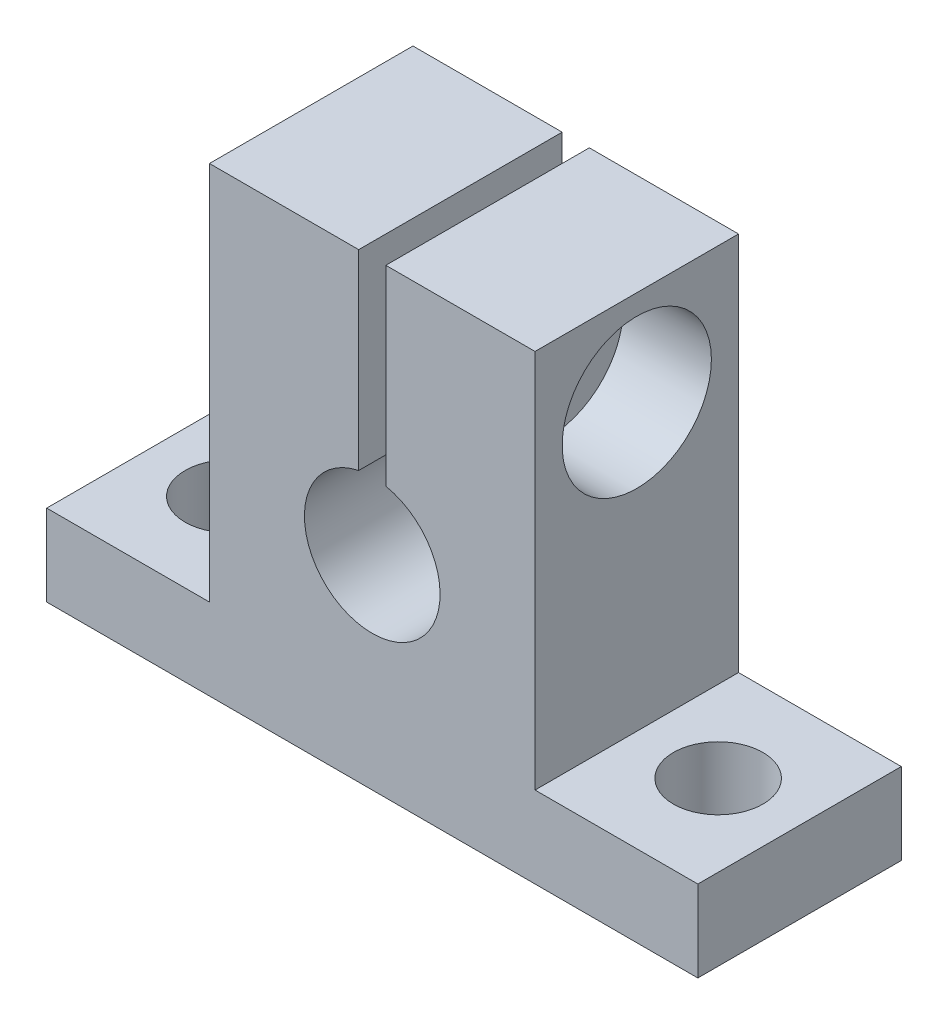
ISO-10303-21;
HEADER;
FILE_DESCRIPTION(('STEP AP214'),'2;1');
FILE_NAME('part.step','',(''),(''),'','','');
FILE_SCHEMA(('AUTOMOTIVE_DESIGN { 1 0 10303 214 1 1 1 1 }'));
ENDSEC;
DATA;
#1=APPLICATION_CONTEXT('core data for automotive mechanical design processes');
#2=APPLICATION_PROTOCOL_DEFINITION('international standard','automotive_design',2000,#1);
#3=PRODUCT_CONTEXT('',#1,'mechanical');
#4=PRODUCT('Part','Part','',(#3));
#5=PRODUCT_RELATED_PRODUCT_CATEGORY('part','',(#4));
#6=PRODUCT_DEFINITION_FORMATION('','',#4);
#7=PRODUCT_DEFINITION_CONTEXT('part definition',#1,'design');
#8=PRODUCT_DEFINITION('design','',#6,#7);
#9=PRODUCT_DEFINITION_SHAPE('','',#8);
#10=(LENGTH_UNIT() NAMED_UNIT(*) SI_UNIT(.MILLI.,.METRE.));
#11=(NAMED_UNIT(*) PLANE_ANGLE_UNIT() SI_UNIT($,.RADIAN.));
#12=(NAMED_UNIT(*) SI_UNIT($,.STERADIAN.) SOLID_ANGLE_UNIT());
#13=UNCERTAINTY_MEASURE_WITH_UNIT(LENGTH_MEASURE(1.E-05),#10,'distance_accuracy_value','');
#14=(GEOMETRIC_REPRESENTATION_CONTEXT(3) GLOBAL_UNCERTAINTY_ASSIGNED_CONTEXT((#13)) GLOBAL_UNIT_ASSIGNED_CONTEXT((#10,
#11,#12)) REPRESENTATION_CONTEXT('',''));
#15=CARTESIAN_POINT('',(0.,0.,0.));
#16=DIRECTION('',(0.,0.,1.));
#17=DIRECTION('',(1.,0.,0.));
#18=AXIS2_PLACEMENT_3D('',#15,#16,#17);
#19=CARTESIAN_POINT('',(12.,6.,7.5));
#20=DIRECTION('',(-1.,0.,0.));
#21=DIRECTION('',(0.,-1.,0.));
#22=AXIS2_PLACEMENT_3D('',#19,#20,#21);
#23=PLANE('',#22);
#24=DIRECTION('',(0.,1.,0.));
#25=VECTOR('',#24,1.);
#26=CARTESIAN_POINT('',(12.,6.,-7.5));
#27=LINE('',#26,#25);
#28=CARTESIAN_POINT('',(12.,6.,-7.5));
#29=VERTEX_POINT('',#28);
#30=CARTESIAN_POINT('',(12.,34.,-7.5));
#31=VERTEX_POINT('',#30);
#32=EDGE_CURVE('E156',#29,#31,#27,.T.);
#33=ORIENTED_EDGE('',*,*,#32,.T.);
#34=DIRECTION('',(0.,0.,-1.));
#35=VECTOR('',#34,1.);
#36=CARTESIAN_POINT('',(12.,34.,7.5));
#37=LINE('',#36,#35);
#38=CARTESIAN_POINT('',(12.,34.,7.5));
#39=VERTEX_POINT('',#38);
#40=EDGE_CURVE('E150',#39,#31,#37,.T.);
#41=ORIENTED_EDGE('',*,*,#40,.F.);
#42=DIRECTION('',(0.,1.,0.));
#43=VECTOR('',#42,1.);
#44=CARTESIAN_POINT('',(12.,6.,7.5));
#45=LINE('',#44,#43);
#46=CARTESIAN_POINT('',(12.,6.,7.5));
#47=VERTEX_POINT('',#46);
#48=EDGE_CURVE('E209',#47,#39,#45,.T.);
#49=ORIENTED_EDGE('',*,*,#48,.F.);
#50=DIRECTION('',(0.,0.,-1.));
#51=VECTOR('',#50,1.);
#52=CARTESIAN_POINT('',(12.,6.,7.5));
#53=LINE('',#52,#51);
#54=EDGE_CURVE('E173',#47,#29,#53,.T.);
#55=ORIENTED_EDGE('',*,*,#54,.T.);
#56=EDGE_LOOP('',(#33,#41,#49,#55));
#57=FACE_BOUND('',#56,.T.);
#58=CARTESIAN_POINT('',(12.,27.,0.));
#59=DIRECTION('',(1.,0.,0.));
#60=DIRECTION('',(0.,0.,-1.));
#61=AXIS2_PLACEMENT_3D('',#58,#59,#60);
#62=CIRCLE('',#61,5.5);
#63=CARTESIAN_POINT('',(12.,27.,-5.5));
#64=VERTEX_POINT('',#63);
#65=EDGE_CURVE('E310',#64,#64,#62,.T.);
#66=ORIENTED_EDGE('',*,*,#65,.F.);
#67=EDGE_LOOP('',(#66));
#68=FACE_BOUND('',#67,.T.);
#69=ADVANCED_FACE('F39',(#57,#68),#23,.F.);
#70=CARTESIAN_POINT('',(12.,34.,7.5));
#71=DIRECTION('',(0.,-1.,0.));
#72=DIRECTION('',(0.,0.,-1.));
#73=AXIS2_PLACEMENT_3D('',#70,#71,#72);
#74=PLANE('',#73);
#75=DIRECTION('',(-1.,0.,0.));
#76=VECTOR('',#75,1.);
#77=CARTESIAN_POINT('',(12.,34.,7.5));
#78=LINE('',#77,#76);
#79=CARTESIAN_POINT('',(-1.,34.,7.5));
#80=VERTEX_POINT('',#79);
#81=CARTESIAN_POINT('',(-12.,34.,7.5));
#82=VERTEX_POINT('',#81);
#83=EDGE_CURVE('E211',#80,#82,#78,.T.);
#84=ORIENTED_EDGE('',*,*,#83,.F.);
#85=DIRECTION('',(0.,0.,1.));
#86=VECTOR('',#85,1.);
#87=CARTESIAN_POINT('',(-1.,34.,-7.5));
#88=LINE('',#87,#86);
#89=CARTESIAN_POINT('',(-1.,34.,-7.5));
#90=VERTEX_POINT('',#89);
#91=EDGE_CURVE('E133',#90,#80,#88,.T.);
#92=ORIENTED_EDGE('',*,*,#91,.F.);
#93=DIRECTION('',(-1.,0.,0.));
#94=VECTOR('',#93,1.);
#95=CARTESIAN_POINT('',(12.,34.,-7.5));
#96=LINE('',#95,#94);
#97=CARTESIAN_POINT('',(-12.,34.,-7.5));
#98=VERTEX_POINT('',#97);
#99=EDGE_CURVE('E152',#90,#98,#96,.T.);
#100=ORIENTED_EDGE('',*,*,#99,.T.);
#101=DIRECTION('',(0.,0.,-1.));
#102=VECTOR('',#101,1.);
#103=CARTESIAN_POINT('',(-12.,34.,7.5));
#104=LINE('',#103,#102);
#105=EDGE_CURVE('E169',#82,#98,#104,.T.);
#106=ORIENTED_EDGE('',*,*,#105,.F.);
#107=EDGE_LOOP('',(#84,#92,#100,#106));
#108=FACE_BOUND('',#107,.T.);
#109=ADVANCED_FACE('F255',(#108),#74,.F.);
#110=CARTESIAN_POINT('',(-24.,6.,7.5));
#111=DIRECTION('',(1.,0.,0.));
#112=DIRECTION('',(0.,0.,-1.));
#113=AXIS2_PLACEMENT_3D('',#110,#111,#112);
#114=PLANE('',#113);
#115=DIRECTION('',(0.,-1.,0.));
#116=VECTOR('',#115,1.);
#117=CARTESIAN_POINT('',(-24.,6.,-7.5));
#118=LINE('',#117,#116);
#119=CARTESIAN_POINT('',(-24.,6.,-7.5));
#120=VERTEX_POINT('',#119);
#121=CARTESIAN_POINT('',(-24.,0.,-7.5));
#122=VERTEX_POINT('',#121);
#123=EDGE_CURVE('E199',#120,#122,#118,.T.);
#124=ORIENTED_EDGE('',*,*,#123,.T.);
#125=DIRECTION('',(0.,0.,-1.));
#126=VECTOR('',#125,1.);
#127=CARTESIAN_POINT('',(-24.,0.,7.5));
#128=LINE('',#127,#126);
#129=CARTESIAN_POINT('',(-24.,0.,7.5));
#130=VERTEX_POINT('',#129);
#131=EDGE_CURVE('E182',#130,#122,#128,.T.);
#132=ORIENTED_EDGE('',*,*,#131,.F.);
#133=DIRECTION('',(0.,-1.,0.));
#134=VECTOR('',#133,1.);
#135=CARTESIAN_POINT('',(-24.,6.,7.5));
#136=LINE('',#135,#134);
#137=CARTESIAN_POINT('',(-24.,6.,7.5));
#138=VERTEX_POINT('',#137);
#139=EDGE_CURVE('E161',#138,#130,#136,.T.);
#140=ORIENTED_EDGE('',*,*,#139,.F.);
#141=DIRECTION('',(0.,0.,-1.));
#142=VECTOR('',#141,1.);
#143=CARTESIAN_POINT('',(-24.,6.,7.5));
#144=LINE('',#143,#142);
#145=EDGE_CURVE('E162',#138,#120,#144,.T.);
#146=ORIENTED_EDGE('',*,*,#145,.T.);
#147=EDGE_LOOP('',(#124,#132,#140,#146));
#148=FACE_BOUND('',#147,.T.);
#149=ADVANCED_FACE('F41',(#148),#114,.F.);
#150=CARTESIAN_POINT('',(-24.,0.,7.5));
#151=DIRECTION('',(0.,1.,0.));
#152=DIRECTION('',(0.,0.,1.));
#153=AXIS2_PLACEMENT_3D('',#150,#151,#152);
#154=PLANE('',#153);
#155=CARTESIAN_POINT('',(18.,0.,0.));
#156=DIRECTION('',(0.,1.,0.));
#157=DIRECTION('',(0.,0.,1.));
#158=AXIS2_PLACEMENT_3D('',#155,#156,#157);
#159=CIRCLE('',#158,3.3);
#160=CARTESIAN_POINT('',(18.,0.,3.29999999999999));
#161=VERTEX_POINT('',#160);
#162=EDGE_CURVE('E293',#161,#161,#159,.T.);
#163=ORIENTED_EDGE('',*,*,#162,.T.);
#164=EDGE_LOOP('',(#163));
#165=FACE_BOUND('',#164,.T.);
#166=CARTESIAN_POINT('',(-18.,0.,0.));
#167=DIRECTION('',(0.,1.,0.));
#168=DIRECTION('',(0.,0.,1.));
#169=AXIS2_PLACEMENT_3D('',#166,#167,#168);
#170=CIRCLE('',#169,3.3);
#171=CARTESIAN_POINT('',(-18.,0.,3.3));
#172=VERTEX_POINT('',#171);
#173=EDGE_CURVE('E296',#172,#172,#170,.T.);
#174=ORIENTED_EDGE('',*,*,#173,.T.);
#175=EDGE_LOOP('',(#174));
#176=FACE_BOUND('',#175,.T.);
#177=DIRECTION('',(1.,0.,0.));
#178=VECTOR('',#177,1.);
#179=CARTESIAN_POINT('',(-24.,0.,-7.5));
#180=LINE('',#179,#178);
#181=CARTESIAN_POINT('',(24.,0.,-7.5));
#182=VERTEX_POINT('',#181);
#183=EDGE_CURVE('E218',#122,#182,#180,.T.);
#184=ORIENTED_EDGE('',*,*,#183,.T.);
#185=DIRECTION('',(0.,0.,-1.));
#186=VECTOR('',#185,1.);
#187=CARTESIAN_POINT('',(24.,0.,7.5));
#188=LINE('',#187,#186);
#189=CARTESIAN_POINT('',(24.,0.,7.5));
#190=VERTEX_POINT('',#189);
#191=EDGE_CURVE('E179',#190,#182,#188,.T.);
#192=ORIENTED_EDGE('',*,*,#191,.F.);
#193=DIRECTION('',(1.,0.,0.));
#194=VECTOR('',#193,1.);
#195=CARTESIAN_POINT('',(-24.,0.,7.5));
#196=LINE('',#195,#194);
#197=EDGE_CURVE('E203',#130,#190,#196,.T.);
#198=ORIENTED_EDGE('',*,*,#197,.F.);
#199=ORIENTED_EDGE('',*,*,#131,.T.);
#200=EDGE_LOOP('',(#184,#192,#198,#199));
#201=FACE_BOUND('',#200,.T.);
#202=ADVANCED_FACE('F240',(#165,#176,#201),#154,.F.);
#203=CARTESIAN_POINT('',(24.,0.,7.5));
#204=DIRECTION('',(-1.,0.,0.));
#205=DIRECTION('',(0.,0.,1.));
#206=AXIS2_PLACEMENT_3D('',#203,#204,#205);
#207=PLANE('',#206);
#208=DIRECTION('',(0.,1.,0.));
#209=VECTOR('',#208,1.);
#210=CARTESIAN_POINT('',(24.,0.,-7.5));
#211=LINE('',#210,#209);
#212=CARTESIAN_POINT('',(24.,6.,-7.5));
#213=VERTEX_POINT('',#212);
#214=EDGE_CURVE('E220',#182,#213,#211,.T.);
#215=ORIENTED_EDGE('',*,*,#214,.T.);
#216=DIRECTION('',(0.,0.,-1.));
#217=VECTOR('',#216,1.);
#218=CARTESIAN_POINT('',(24.,6.,7.5));
#219=LINE('',#218,#217);
#220=CARTESIAN_POINT('',(24.,6.,7.5));
#221=VERTEX_POINT('',#220);
#222=EDGE_CURVE('E176',#221,#213,#219,.T.);
#223=ORIENTED_EDGE('',*,*,#222,.F.);
#224=DIRECTION('',(0.,1.,0.));
#225=VECTOR('',#224,1.);
#226=CARTESIAN_POINT('',(24.,0.,7.5));
#227=LINE('',#226,#225);
#228=EDGE_CURVE('E205',#190,#221,#227,.T.);
#229=ORIENTED_EDGE('',*,*,#228,.F.);
#230=ORIENTED_EDGE('',*,*,#191,.T.);
#231=EDGE_LOOP('',(#215,#223,#229,#230));
#232=FACE_BOUND('',#231,.T.);
#233=ADVANCED_FACE('F232',(#232),#207,.F.);
#234=CARTESIAN_POINT('',(24.,6.,7.5));
#235=DIRECTION('',(0.,-1.,0.));
#236=DIRECTION('',(1.,0.,0.));
#237=AXIS2_PLACEMENT_3D('',#234,#235,#236);
#238=PLANE('',#237);
#239=CARTESIAN_POINT('',(18.,6.,0.));
#240=DIRECTION('',(0.,1.,0.));
#241=DIRECTION('',(0.,0.,1.));
#242=AXIS2_PLACEMENT_3D('',#239,#240,#241);
#243=CIRCLE('',#242,3.3);
#244=CARTESIAN_POINT('',(18.,6.,3.3));
#245=VERTEX_POINT('',#244);
#246=EDGE_CURVE('E352',#245,#245,#243,.T.);
#247=ORIENTED_EDGE('',*,*,#246,.F.);
#248=EDGE_LOOP('',(#247));
#249=FACE_BOUND('',#248,.T.);
#250=DIRECTION('',(-1.,0.,0.));
#251=VECTOR('',#250,1.);
#252=CARTESIAN_POINT('',(24.,6.,-7.5));
#253=LINE('',#252,#251);
#254=EDGE_CURVE('E221',#213,#29,#253,.T.);
#255=ORIENTED_EDGE('',*,*,#254,.T.);
#256=ORIENTED_EDGE('',*,*,#54,.F.);
#257=DIRECTION('',(-1.,0.,0.));
#258=VECTOR('',#257,1.);
#259=CARTESIAN_POINT('',(24.,6.,7.5));
#260=LINE('',#259,#258);
#261=EDGE_CURVE('E207',#221,#47,#260,.T.);
#262=ORIENTED_EDGE('',*,*,#261,.F.);
#263=ORIENTED_EDGE('',*,*,#222,.T.);
#264=EDGE_LOOP('',(#255,#256,#262,#263));
#265=FACE_BOUND('',#264,.T.);
#266=ADVANCED_FACE('F236',(#249,#265),#238,.F.);
#267=CARTESIAN_POINT('',(1.,34.,-7.5));
#268=VERTEX_POINT('',#267);
#269=EDGE_CURVE('E141',#31,#268,#96,.T.);
#270=ORIENTED_EDGE('',*,*,#269,.T.);
#271=DIRECTION('',(0.,0.,1.));
#272=VECTOR('',#271,1.);
#273=CARTESIAN_POINT('',(1.,34.,-7.5));
#274=LINE('',#273,#272);
#275=CARTESIAN_POINT('',(1.,34.,7.5));
#276=VERTEX_POINT('',#275);
#277=EDGE_CURVE('E125',#268,#276,#274,.T.);
#278=ORIENTED_EDGE('',*,*,#277,.T.);
#279=EDGE_CURVE('E191',#39,#276,#78,.T.);
#280=ORIENTED_EDGE('',*,*,#279,.F.);
#281=ORIENTED_EDGE('',*,*,#40,.T.);
#282=EDGE_LOOP('',(#270,#278,#280,#281));
#283=FACE_BOUND('',#282,.T.);
#284=ADVANCED_FACE('F148',(#283),#74,.F.);
#285=CARTESIAN_POINT('',(-12.,34.,7.5));
#286=DIRECTION('',(1.,0.,0.));
#287=DIRECTION('',(0.,1.,0.));
#288=AXIS2_PLACEMENT_3D('',#285,#286,#287);
#289=PLANE('',#288);
#290=CARTESIAN_POINT('',(-12.,27.,0.));
#291=DIRECTION('',(1.,0.,0.));
#292=DIRECTION('',(0.,1.,0.));
#293=AXIS2_PLACEMENT_3D('',#290,#291,#292);
#294=CIRCLE('',#293,2.49999999999999);
#295=CARTESIAN_POINT('',(-12.,29.5,0.));
#296=VERTEX_POINT('',#295);
#297=EDGE_CURVE('E302',#296,#296,#294,.T.);
#298=ORIENTED_EDGE('',*,*,#297,.T.);
#299=EDGE_LOOP('',(#298));
#300=FACE_BOUND('',#299,.T.);
#301=DIRECTION('',(0.,-1.,0.));
#302=VECTOR('',#301,1.);
#303=CARTESIAN_POINT('',(-12.,34.,-7.5));
#304=LINE('',#303,#302);
#305=CARTESIAN_POINT('',(-12.,6.,-7.5));
#306=VERTEX_POINT('',#305);
#307=EDGE_CURVE('E151',#98,#306,#304,.T.);
#308=ORIENTED_EDGE('',*,*,#307,.T.);
#309=DIRECTION('',(0.,0.,-1.));
#310=VECTOR('',#309,1.);
#311=CARTESIAN_POINT('',(-12.,6.,7.5));
#312=LINE('',#311,#310);
#313=CARTESIAN_POINT('',(-12.,6.,7.5));
#314=VERTEX_POINT('',#313);
#315=EDGE_CURVE('E165',#314,#306,#312,.T.);
#316=ORIENTED_EDGE('',*,*,#315,.F.);
#317=DIRECTION('',(0.,-1.,0.));
#318=VECTOR('',#317,1.);
#319=CARTESIAN_POINT('',(-12.,34.,7.5));
#320=LINE('',#319,#318);
#321=EDGE_CURVE('E213',#82,#314,#320,.T.);
#322=ORIENTED_EDGE('',*,*,#321,.F.);
#323=ORIENTED_EDGE('',*,*,#105,.T.);
#324=EDGE_LOOP('',(#308,#316,#322,#323));
#325=FACE_BOUND('',#324,.T.);
#326=ADVANCED_FACE('F251',(#300,#325),#289,.F.);
#327=CARTESIAN_POINT('',(-12.,6.,7.5));
#328=DIRECTION('',(0.,-1.,0.));
#329=DIRECTION('',(1.,0.,0.));
#330=AXIS2_PLACEMENT_3D('',#327,#328,#329);
#331=PLANE('',#330);
#332=CARTESIAN_POINT('',(-18.,6.,0.));
#333=DIRECTION('',(0.,1.,0.));
#334=DIRECTION('',(0.,0.,1.));
#335=AXIS2_PLACEMENT_3D('',#332,#333,#334);
#336=CIRCLE('',#335,3.3);
#337=CARTESIAN_POINT('',(-18.,6.,3.3));
#338=VERTEX_POINT('',#337);
#339=EDGE_CURVE('E299',#338,#338,#336,.T.);
#340=ORIENTED_EDGE('',*,*,#339,.F.);
#341=EDGE_LOOP('',(#340));
#342=FACE_BOUND('',#341,.T.);
#343=DIRECTION('',(-1.,0.,0.));
#344=VECTOR('',#343,1.);
#345=CARTESIAN_POINT('',(-12.,6.,-7.5));
#346=LINE('',#345,#344);
#347=EDGE_CURVE('E154',#306,#120,#346,.T.);
#348=ORIENTED_EDGE('',*,*,#347,.T.);
#349=ORIENTED_EDGE('',*,*,#145,.F.);
#350=DIRECTION('',(-1.,0.,0.));
#351=VECTOR('',#350,1.);
#352=CARTESIAN_POINT('',(-12.,6.,7.5));
#353=LINE('',#352,#351);
#354=EDGE_CURVE('E166',#314,#138,#353,.T.);
#355=ORIENTED_EDGE('',*,*,#354,.F.);
#356=ORIENTED_EDGE('',*,*,#315,.T.);
#357=EDGE_LOOP('',(#348,#349,#355,#356));
#358=FACE_BOUND('',#357,.T.);
#359=ADVANCED_FACE('F246',(#342,#358),#331,.F.);
#360=CARTESIAN_POINT('',(0.,0.,7.5));
#361=DIRECTION('',(0.,0.,1.));
#362=DIRECTION('',(1.,0.,0.));
#363=AXIS2_PLACEMENT_3D('',#360,#361,#362);
#364=PLANE('',#363);
#365=DIRECTION('',(0.,-1.,0.));
#366=VECTOR('',#365,1.);
#367=CARTESIAN_POINT('',(-1.,34.,7.5));
#368=LINE('',#367,#366);
#369=CARTESIAN_POINT('',(-0.999999999999999,19.8989794855664,7.5));
#370=VERTEX_POINT('',#369);
#371=EDGE_CURVE('E54',#80,#370,#368,.T.);
#372=ORIENTED_EDGE('',*,*,#371,.F.);
#373=ORIENTED_EDGE('',*,*,#83,.T.);
#374=ORIENTED_EDGE('',*,*,#321,.T.);
#375=ORIENTED_EDGE('',*,*,#354,.T.);
#376=ORIENTED_EDGE('',*,*,#139,.T.);
#377=ORIENTED_EDGE('',*,*,#197,.T.);
#378=ORIENTED_EDGE('',*,*,#228,.T.);
#379=ORIENTED_EDGE('',*,*,#261,.T.);
#380=ORIENTED_EDGE('',*,*,#48,.T.);
#381=ORIENTED_EDGE('',*,*,#279,.T.);
#382=DIRECTION('',(0.,1.,0.));
#383=VECTOR('',#382,1.);
#384=CARTESIAN_POINT('',(1.,34.,7.5));
#385=LINE('',#384,#383);
#386=CARTESIAN_POINT('',(0.999999999999999,19.8989794855664,7.5));
#387=VERTEX_POINT('',#386);
#388=EDGE_CURVE('E128',#387,#276,#385,.T.);
#389=ORIENTED_EDGE('',*,*,#388,.F.);
#390=CARTESIAN_POINT('',(0.,15.,7.5));
#391=DIRECTION('',(0.,0.,1.));
#392=DIRECTION('',(1.,0.,0.));
#393=AXIS2_PLACEMENT_3D('',#390,#391,#392);
#394=CIRCLE('',#393,5.);
#395=EDGE_CURVE('E188',#370,#387,#394,.T.);
#396=ORIENTED_EDGE('',*,*,#395,.F.);
#397=EDGE_LOOP('',(#372,#373,#374,#375,#376,#377,#378,#379,#380,#381,#389,#396));
#398=FACE_BOUND('',#397,.T.);
#399=ADVANCED_FACE('F190',(#398),#364,.T.);
#400=CARTESIAN_POINT('',(0.,0.,-7.5));
#401=DIRECTION('',(0.,0.,1.));
#402=DIRECTION('',(1.,0.,0.));
#403=AXIS2_PLACEMENT_3D('',#400,#401,#402);
#404=PLANE('',#403);
#405=ORIENTED_EDGE('',*,*,#99,.F.);
#406=DIRECTION('',(0.,-1.,0.));
#407=VECTOR('',#406,1.);
#408=CARTESIAN_POINT('',(-1.,34.,-7.5));
#409=LINE('',#408,#407);
#410=CARTESIAN_POINT('',(-0.999999999999999,19.8989794855664,-7.5));
#411=VERTEX_POINT('',#410);
#412=EDGE_CURVE('E145',#90,#411,#409,.T.);
#413=ORIENTED_EDGE('',*,*,#412,.T.);
#414=CARTESIAN_POINT('',(0.,15.,-7.5));
#415=DIRECTION('',(0.,0.,1.));
#416=DIRECTION('',(1.,0.,0.));
#417=AXIS2_PLACEMENT_3D('',#414,#415,#416);
#418=CIRCLE('',#417,5.);
#419=CARTESIAN_POINT('',(0.999999999999999,19.8989794855664,-7.5));
#420=VERTEX_POINT('',#419);
#421=EDGE_CURVE('E144',#411,#420,#418,.T.);
#422=ORIENTED_EDGE('',*,*,#421,.T.);
#423=DIRECTION('',(0.,1.,0.));
#424=VECTOR('',#423,1.);
#425=CARTESIAN_POINT('',(1.,34.,-7.5));
#426=LINE('',#425,#424);
#427=EDGE_CURVE('E61',#420,#268,#426,.T.);
#428=ORIENTED_EDGE('',*,*,#427,.T.);
#429=ORIENTED_EDGE('',*,*,#269,.F.);
#430=ORIENTED_EDGE('',*,*,#32,.F.);
#431=ORIENTED_EDGE('',*,*,#254,.F.);
#432=ORIENTED_EDGE('',*,*,#214,.F.);
#433=ORIENTED_EDGE('',*,*,#183,.F.);
#434=ORIENTED_EDGE('',*,*,#123,.F.);
#435=ORIENTED_EDGE('',*,*,#347,.F.);
#436=ORIENTED_EDGE('',*,*,#307,.F.);
#437=EDGE_LOOP('',(#405,#413,#422,#428,#429,#430,#431,#432,#433,#434,#435,#436));
#438=FACE_BOUND('',#437,.T.);
#439=ADVANCED_FACE('F139',(#438),#404,.F.);
#440=CARTESIAN_POINT('',(0.,15.,-7.5));
#441=DIRECTION('',(0.,0.,1.));
#442=DIRECTION('',(1.,0.,0.));
#443=AXIS2_PLACEMENT_3D('',#440,#441,#442);
#444=CYLINDRICAL_SURFACE('',#443,5.);
#445=ORIENTED_EDGE('',*,*,#421,.F.);
#446=DIRECTION('',(0.,0.,1.));
#447=VECTOR('',#446,1.);
#448=CARTESIAN_POINT('',(-0.999999999999999,19.8989794855664,-7.5));
#449=LINE('',#448,#447);
#450=EDGE_CURVE('E11',#411,#370,#449,.T.);
#451=ORIENTED_EDGE('',*,*,#450,.T.);
#452=ORIENTED_EDGE('',*,*,#395,.T.);
#453=DIRECTION('',(0.,0.,1.));
#454=VECTOR('',#453,1.);
#455=CARTESIAN_POINT('',(0.999999999999999,19.8989794855664,-7.5));
#456=LINE('',#455,#454);
#457=EDGE_CURVE('E47',#387,#420,#456,.F.);
#458=ORIENTED_EDGE('',*,*,#457,.T.);
#459=EDGE_LOOP('',(#445,#451,#452,#458));
#460=FACE_BOUND('',#459,.T.);
#461=ADVANCED_FACE('F186',(#460),#444,.F.);
#462=CARTESIAN_POINT('',(1.,34.,-7.5));
#463=DIRECTION('',(1.,0.,0.));
#464=DIRECTION('',(0.,1.,0.));
#465=AXIS2_PLACEMENT_3D('',#462,#463,#464);
#466=PLANE('',#465);
#467=CARTESIAN_POINT('',(0.999999999999999,27.,0.));
#468=DIRECTION('',(1.,0.,0.));
#469=DIRECTION('',(0.,1.,0.));
#470=AXIS2_PLACEMENT_3D('',#467,#468,#469);
#471=CIRCLE('',#470,3.3);
#472=CARTESIAN_POINT('',(1.,30.3,0.));
#473=VERTEX_POINT('',#472);
#474=EDGE_CURVE('E194',#473,#473,#471,.T.);
#475=ORIENTED_EDGE('',*,*,#474,.T.);
#476=EDGE_LOOP('',(#475));
#477=FACE_BOUND('',#476,.T.);
#478=ORIENTED_EDGE('',*,*,#388,.T.);
#479=ORIENTED_EDGE('',*,*,#277,.F.);
#480=ORIENTED_EDGE('',*,*,#427,.F.);
#481=ORIENTED_EDGE('',*,*,#457,.F.);
#482=EDGE_LOOP('',(#478,#479,#480,#481));
#483=FACE_BOUND('',#482,.T.);
#484=ADVANCED_FACE('F126',(#477,#483),#466,.F.);
#485=CARTESIAN_POINT('',(-1.,34.,-7.5));
#486=DIRECTION('',(-1.,0.,0.));
#487=DIRECTION('',(0.,-1.,0.));
#488=AXIS2_PLACEMENT_3D('',#485,#486,#487);
#489=PLANE('',#488);
#490=CARTESIAN_POINT('',(-1.,27.,0.));
#491=DIRECTION('',(1.,0.,0.));
#492=DIRECTION('',(0.,0.,-1.));
#493=AXIS2_PLACEMENT_3D('',#490,#491,#492);
#494=CIRCLE('',#493,2.49999999999999);
#495=CARTESIAN_POINT('',(-1.,27.,-2.49999999999999));
#496=VERTEX_POINT('',#495);
#497=EDGE_CURVE('E298',#496,#496,#494,.T.);
#498=ORIENTED_EDGE('',*,*,#497,.F.);
#499=EDGE_LOOP('',(#498));
#500=FACE_BOUND('',#499,.T.);
#501=ORIENTED_EDGE('',*,*,#412,.F.);
#502=ORIENTED_EDGE('',*,*,#91,.T.);
#503=ORIENTED_EDGE('',*,*,#371,.T.);
#504=ORIENTED_EDGE('',*,*,#450,.F.);
#505=EDGE_LOOP('',(#501,#502,#503,#504));
#506=FACE_BOUND('',#505,.T.);
#507=ADVANCED_FACE('F257',(#500,#506),#489,.F.);
#508=CARTESIAN_POINT('',(12.,27.,0.));
#509=DIRECTION('',(1.,0.,0.));
#510=DIRECTION('',(0.,0.,-1.));
#511=AXIS2_PLACEMENT_3D('',#508,#509,#510);
#512=CYLINDRICAL_SURFACE('',#511,3.3);
#513=ORIENTED_EDGE('',*,*,#474,.F.);
#514=EDGE_LOOP('',(#513));
#515=FACE_BOUND('',#514,.T.);
#516=CARTESIAN_POINT('',(5.5,27.,0.));
#517=DIRECTION('',(1.,0.,0.));
#518=DIRECTION('',(0.,0.,-1.));
#519=AXIS2_PLACEMENT_3D('',#516,#517,#518);
#520=CIRCLE('',#519,3.3);
#521=CARTESIAN_POINT('',(5.5,27.,-3.3));
#522=VERTEX_POINT('',#521);
#523=EDGE_CURVE('E316',#522,#522,#520,.T.);
#524=ORIENTED_EDGE('',*,*,#523,.T.);
#525=EDGE_LOOP('',(#524));
#526=FACE_BOUND('',#525,.T.);
#527=ADVANCED_FACE('F259',(#515,#526),#512,.F.);
#528=CARTESIAN_POINT('',(5.5,30.3,0.));
#529=DIRECTION('',(-1.,0.,0.));
#530=DIRECTION('',(0.,0.,1.));
#531=AXIS2_PLACEMENT_3D('',#528,#529,#530);
#532=PLANE('',#531);
#533=ORIENTED_EDGE('',*,*,#523,.F.);
#534=EDGE_LOOP('',(#533));
#535=FACE_BOUND('',#534,.T.);
#536=CARTESIAN_POINT('',(5.5,27.,0.));
#537=DIRECTION('',(1.,0.,0.));
#538=DIRECTION('',(0.,0.,-1.));
#539=AXIS2_PLACEMENT_3D('',#536,#537,#538);
#540=CIRCLE('',#539,5.5);
#541=CARTESIAN_POINT('',(5.5,27.,-5.5));
#542=VERTEX_POINT('',#541);
#543=EDGE_CURVE('E313',#542,#542,#540,.T.);
#544=ORIENTED_EDGE('',*,*,#543,.T.);
#545=EDGE_LOOP('',(#544));
#546=FACE_BOUND('',#545,.T.);
#547=ADVANCED_FACE('F266',(#535,#546),#532,.F.);
#548=CARTESIAN_POINT('',(12.,27.,0.));
#549=DIRECTION('',(1.,0.,0.));
#550=DIRECTION('',(0.,0.,-1.));
#551=AXIS2_PLACEMENT_3D('',#548,#549,#550);
#552=CYLINDRICAL_SURFACE('',#551,5.5);
#553=ORIENTED_EDGE('',*,*,#543,.F.);
#554=EDGE_LOOP('',(#553));
#555=FACE_BOUND('',#554,.T.);
#556=ORIENTED_EDGE('',*,*,#65,.T.);
#557=EDGE_LOOP('',(#556));
#558=FACE_BOUND('',#557,.T.);
#559=ADVANCED_FACE('F326',(#555,#558),#552,.F.);
#560=CARTESIAN_POINT('',(-1.00000000000001,27.,0.));
#561=DIRECTION('',(1.,0.,0.));
#562=DIRECTION('',(0.,0.,-1.));
#563=AXIS2_PLACEMENT_3D('',#560,#561,#562);
#564=CYLINDRICAL_SURFACE('',#563,2.49999999999999);
#565=ORIENTED_EDGE('',*,*,#497,.T.);
#566=EDGE_LOOP('',(#565));
#567=FACE_BOUND('',#566,.T.);
#568=ORIENTED_EDGE('',*,*,#297,.F.);
#569=EDGE_LOOP('',(#568));
#570=FACE_BOUND('',#569,.T.);
#571=ADVANCED_FACE('F332',(#567,#570),#564,.F.);
#572=CARTESIAN_POINT('',(-18.,6.,0.));
#573=DIRECTION('',(0.,1.,0.));
#574=DIRECTION('',(0.,0.,1.));
#575=AXIS2_PLACEMENT_3D('',#572,#573,#574);
#576=CYLINDRICAL_SURFACE('',#575,3.3);
#577=ORIENTED_EDGE('',*,*,#173,.F.);
#578=EDGE_LOOP('',(#577));
#579=FACE_BOUND('',#578,.T.);
#580=ORIENTED_EDGE('',*,*,#339,.T.);
#581=EDGE_LOOP('',(#580));
#582=FACE_BOUND('',#581,.T.);
#583=ADVANCED_FACE('F338',(#579,#582),#576,.F.);
#584=CARTESIAN_POINT('',(18.,6.,0.));
#585=DIRECTION('',(0.,1.,0.));
#586=DIRECTION('',(0.,0.,1.));
#587=AXIS2_PLACEMENT_3D('',#584,#585,#586);
#588=CYLINDRICAL_SURFACE('',#587,3.3);
#589=ORIENTED_EDGE('',*,*,#162,.F.);
#590=EDGE_LOOP('',(#589));
#591=FACE_BOUND('',#590,.T.);
#592=ORIENTED_EDGE('',*,*,#246,.T.);
#593=EDGE_LOOP('',(#592));
#594=FACE_BOUND('',#593,.T.);
#595=ADVANCED_FACE('F344',(#591,#594),#588,.F.);
#596=CLOSED_SHELL('',(#69,#109,#149,#202,#233,#266,#284,#326,#359,#399,#439,#461,#484,#507,#527,
#547,#559,#571,#583,#595));
#597=MANIFOLD_SOLID_BREP('B2',#596);
#598=ADVANCED_BREP_SHAPE_REPRESENTATION('',(#18,#597),#14);
#599=SHAPE_DEFINITION_REPRESENTATION(#9,#598);
ENDSEC;
END-ISO-10303-21;
